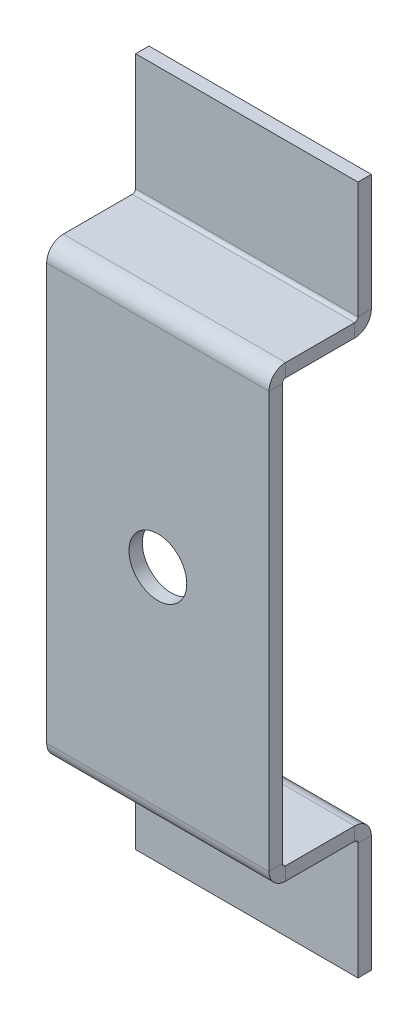
ISO-10303-21;
HEADER;
FILE_DESCRIPTION(('STEP AP214'),'2;1');
FILE_NAME('part.step','',(''),(''),'','','');
FILE_SCHEMA(('AUTOMOTIVE_DESIGN { 1 0 10303 214 1 1 1 1 }'));
ENDSEC;
DATA;
#1=APPLICATION_CONTEXT('core data for automotive mechanical design processes');
#2=APPLICATION_PROTOCOL_DEFINITION('international standard','automotive_design',2000,#1);
#3=PRODUCT_CONTEXT('',#1,'mechanical');
#4=PRODUCT('Part','Part','',(#3));
#5=PRODUCT_RELATED_PRODUCT_CATEGORY('part','',(#4));
#6=PRODUCT_DEFINITION_FORMATION('','',#4);
#7=PRODUCT_DEFINITION_CONTEXT('part definition',#1,'design');
#8=PRODUCT_DEFINITION('design','',#6,#7);
#9=PRODUCT_DEFINITION_SHAPE('','',#8);
#10=(LENGTH_UNIT() NAMED_UNIT(*) SI_UNIT(.MILLI.,.METRE.));
#11=(NAMED_UNIT(*) PLANE_ANGLE_UNIT() SI_UNIT($,.RADIAN.));
#12=(NAMED_UNIT(*) SI_UNIT($,.STERADIAN.) SOLID_ANGLE_UNIT());
#13=UNCERTAINTY_MEASURE_WITH_UNIT(LENGTH_MEASURE(1.E-05),#10,'distance_accuracy_value','');
#14=(GEOMETRIC_REPRESENTATION_CONTEXT(3) GLOBAL_UNCERTAINTY_ASSIGNED_CONTEXT((#13)) GLOBAL_UNIT_ASSIGNED_CONTEXT((#10,
#11,#12)) REPRESENTATION_CONTEXT('',''));
#15=CARTESIAN_POINT('',(0.,0.,0.));
#16=DIRECTION('',(0.,0.,1.));
#17=DIRECTION('',(1.,0.,0.));
#18=AXIS2_PLACEMENT_3D('',#15,#16,#17);
#19=CARTESIAN_POINT('',(0.,98.0000000000001,-20.));
#20=DIRECTION('',(-1.,0.,0.));
#21=DIRECTION('',(0.,0.,1.));
#22=AXIS2_PLACEMENT_3D('',#19,#20,#21);
#23=PLANE('',#22);
#24=DIRECTION('',(0.,0.,-1.));
#25=VECTOR('',#24,1.);
#26=CARTESIAN_POINT('',(0.,98.0000000000001,-20.));
#27=LINE('',#26,#25);
#28=CARTESIAN_POINT('',(0.,98.,-3.7366));
#29=VERTEX_POINT('',#28);
#30=CARTESIAN_POINT('',(0.,98.0000000000001,-19.2634));
#31=VERTEX_POINT('',#30);
#32=EDGE_CURVE('E351',#29,#31,#27,.T.);
#33=ORIENTED_EDGE('',*,*,#32,.T.);
#34=DIRECTION('',(0.,-1.,0.));
#35=VECTOR('',#34,1.);
#36=CARTESIAN_POINT('',(0.,98.0000000000001,-19.2634));
#37=LINE('',#36,#35);
#38=CARTESIAN_POINT('',(0.,95.0000000000001,-19.2634));
#39=VERTEX_POINT('',#38);
#40=EDGE_CURVE('E233',#31,#39,#37,.T.);
#41=ORIENTED_EDGE('',*,*,#40,.T.);
#42=DIRECTION('',(0.,0.,-1.));
#43=VECTOR('',#42,1.);
#44=CARTESIAN_POINT('',(0.,95.0000000000001,-20.));
#45=LINE('',#44,#43);
#46=CARTESIAN_POINT('',(0.,95.,-3.73660000000001));
#47=VERTEX_POINT('',#46);
#48=EDGE_CURVE('E350',#47,#39,#45,.T.);
#49=ORIENTED_EDGE('',*,*,#48,.F.);
#50=DIRECTION('',(0.,1.,0.));
#51=VECTOR('',#50,1.);
#52=CARTESIAN_POINT('',(0.,95.,-3.73660000000001));
#53=LINE('',#52,#51);
#54=EDGE_CURVE('E336',#47,#29,#53,.T.);
#55=ORIENTED_EDGE('',*,*,#54,.T.);
#56=EDGE_LOOP('',(#33,#41,#49,#55));
#57=FACE_BOUND('',#56,.T.);
#58=ADVANCED_FACE('F39',(#57),#23,.T.);
#59=CARTESIAN_POINT('',(0.,98.,3.20683818544146E-13));
#60=DIRECTION('',(0.,1.,0.));
#61=DIRECTION('',(0.,0.,1.));
#62=AXIS2_PLACEMENT_3D('',#59,#60,#61);
#63=PLANE('',#62);
#64=DIRECTION('',(0.,0.,1.));
#65=VECTOR('',#64,1.);
#66=CARTESIAN_POINT('',(50.,98.,-2.99999999999999));
#67=LINE('',#66,#65);
#68=CARTESIAN_POINT('',(50.,98.0000000000001,-19.2634));
#69=VERTEX_POINT('',#68);
#70=CARTESIAN_POINT('',(50.,98.,-3.7366));
#71=VERTEX_POINT('',#70);
#72=EDGE_CURVE('E353',#69,#71,#67,.T.);
#73=ORIENTED_EDGE('',*,*,#72,.F.);
#74=DIRECTION('',(-1.,0.,0.));
#75=VECTOR('',#74,1.);
#76=CARTESIAN_POINT('',(0.,98.0000000000001,-19.2634));
#77=LINE('',#76,#75);
#78=EDGE_CURVE('E63',#31,#69,#77,.F.);
#79=ORIENTED_EDGE('',*,*,#78,.F.);
#80=ORIENTED_EDGE('',*,*,#32,.F.);
#81=DIRECTION('',(1.,0.,0.));
#82=VECTOR('',#81,1.);
#83=CARTESIAN_POINT('',(0.,98.,-3.7366));
#84=LINE('',#83,#82);
#85=EDGE_CURVE('E345',#29,#71,#84,.T.);
#86=ORIENTED_EDGE('',*,*,#85,.T.);
#87=EDGE_LOOP('',(#73,#79,#80,#86));
#88=FACE_BOUND('',#87,.T.);
#89=ADVANCED_FACE('F400',(#88),#63,.T.);
#90=CARTESIAN_POINT('',(0.,95.,3.10209374527617E-13));
#91=DIRECTION('',(0.,1.,0.));
#92=DIRECTION('',(0.,0.,1.));
#93=AXIS2_PLACEMENT_3D('',#90,#91,#92);
#94=PLANE('',#93);
#95=DIRECTION('',(-1.,0.,0.));
#96=VECTOR('',#95,1.);
#97=CARTESIAN_POINT('',(0.,95.0000000000001,-19.2634));
#98=LINE('',#97,#96);
#99=CARTESIAN_POINT('',(50.,95.0000000000001,-19.2634));
#100=VERTEX_POINT('',#99);
#101=EDGE_CURVE('E186',#39,#100,#98,.F.);
#102=ORIENTED_EDGE('',*,*,#101,.T.);
#103=DIRECTION('',(0.,0.,1.));
#104=VECTOR('',#103,1.);
#105=CARTESIAN_POINT('',(50.,95.,-3.));
#106=LINE('',#105,#104);
#107=CARTESIAN_POINT('',(50.,95.,-3.73660000000001));
#108=VERTEX_POINT('',#107);
#109=EDGE_CURVE('E354',#100,#108,#106,.T.);
#110=ORIENTED_EDGE('',*,*,#109,.T.);
#111=DIRECTION('',(1.,0.,0.));
#112=VECTOR('',#111,1.);
#113=CARTESIAN_POINT('',(0.,95.,-3.73660000000001));
#114=LINE('',#113,#112);
#115=EDGE_CURVE('E339',#47,#108,#114,.T.);
#116=ORIENTED_EDGE('',*,*,#115,.F.);
#117=ORIENTED_EDGE('',*,*,#48,.T.);
#118=EDGE_LOOP('',(#102,#110,#116,#117));
#119=FACE_BOUND('',#118,.T.);
#120=ADVANCED_FACE('F408',(#119),#94,.F.);
#121=CARTESIAN_POINT('',(50.,-3.,-2.99999999999999));
#122=DIRECTION('',(1.,0.,0.));
#123=DIRECTION('',(0.,0.,-1.));
#124=AXIS2_PLACEMENT_3D('',#121,#122,#123);
#125=PLANE('',#124);
#126=DIRECTION('',(0.,0.,-1.));
#127=VECTOR('',#126,1.);
#128=CARTESIAN_POINT('',(50.,-3.,-2.99999999999999));
#129=LINE('',#128,#127);
#130=CARTESIAN_POINT('',(50.,-3.,-3.73659999999999));
#131=VERTEX_POINT('',#130);
#132=CARTESIAN_POINT('',(50.,-3.00000000000006,-19.2634));
#133=VERTEX_POINT('',#132);
#134=EDGE_CURVE('E306',#131,#133,#129,.T.);
#135=ORIENTED_EDGE('',*,*,#134,.T.);
#136=DIRECTION('',(0.,1.,0.));
#137=VECTOR('',#136,1.);
#138=CARTESIAN_POINT('',(50.,-3.00000000000006,-19.2634));
#139=LINE('',#138,#137);
#140=CARTESIAN_POINT('',(50.,0.,-19.2634));
#141=VERTEX_POINT('',#140);
#142=EDGE_CURVE('E279',#133,#141,#139,.T.);
#143=ORIENTED_EDGE('',*,*,#142,.T.);
#144=DIRECTION('',(0.,0.,-1.));
#145=VECTOR('',#144,1.);
#146=CARTESIAN_POINT('',(50.,0.,-3.));
#147=LINE('',#146,#145);
#148=CARTESIAN_POINT('',(50.,0.,-3.7366));
#149=VERTEX_POINT('',#148);
#150=EDGE_CURVE('E305',#149,#141,#147,.T.);
#151=ORIENTED_EDGE('',*,*,#150,.F.);
#152=DIRECTION('',(0.,-1.,0.));
#153=VECTOR('',#152,1.);
#154=CARTESIAN_POINT('',(50.,0.,-3.7366));
#155=LINE('',#154,#153);
#156=EDGE_CURVE('E292',#149,#131,#155,.T.);
#157=ORIENTED_EDGE('',*,*,#156,.T.);
#158=EDGE_LOOP('',(#135,#143,#151,#157));
#159=FACE_BOUND('',#158,.T.);
#160=ADVANCED_FACE('F432',(#159),#125,.T.);
#161=CARTESIAN_POINT('',(0.,-2.99999999999999,0.));
#162=DIRECTION('',(0.,1.,0.));
#163=DIRECTION('',(0.,0.,1.));
#164=AXIS2_PLACEMENT_3D('',#161,#162,#163);
#165=PLANE('',#164);
#166=DIRECTION('',(1.,0.,0.));
#167=VECTOR('',#166,1.);
#168=CARTESIAN_POINT('',(50.,-3.00000000000006,-19.2634));
#169=LINE('',#168,#167);
#170=CARTESIAN_POINT('',(0.,-3.00000000000006,-19.2634));
#171=VERTEX_POINT('',#170);
#172=EDGE_CURVE('E285',#133,#171,#169,.F.);
#173=ORIENTED_EDGE('',*,*,#172,.F.);
#174=ORIENTED_EDGE('',*,*,#134,.F.);
#175=DIRECTION('',(1.,0.,0.));
#176=VECTOR('',#175,1.);
#177=CARTESIAN_POINT('',(0.,-3.,-3.73659999999999));
#178=LINE('',#177,#176);
#179=CARTESIAN_POINT('',(0.,-3.,-3.73659999999999));
#180=VERTEX_POINT('',#179);
#181=EDGE_CURVE('E301',#180,#131,#178,.T.);
#182=ORIENTED_EDGE('',*,*,#181,.F.);
#183=DIRECTION('',(0.,0.,1.));
#184=VECTOR('',#183,1.);
#185=CARTESIAN_POINT('',(0.,-3.00000000000006,-20.));
#186=LINE('',#185,#184);
#187=EDGE_CURVE('E309',#171,#180,#186,.T.);
#188=ORIENTED_EDGE('',*,*,#187,.F.);
#189=EDGE_LOOP('',(#173,#174,#182,#188));
#190=FACE_BOUND('',#189,.T.);
#191=ADVANCED_FACE('F445',(#190),#165,.F.);
#192=CARTESIAN_POINT('',(0.,0.,0.));
#193=DIRECTION('',(0.,1.,0.));
#194=DIRECTION('',(0.,0.,1.));
#195=AXIS2_PLACEMENT_3D('',#192,#193,#194);
#196=PLANE('',#195);
#197=ORIENTED_EDGE('',*,*,#150,.T.);
#198=DIRECTION('',(1.,0.,0.));
#199=VECTOR('',#198,1.);
#200=CARTESIAN_POINT('',(50.,0.,-19.2634));
#201=LINE('',#200,#199);
#202=CARTESIAN_POINT('',(0.,0.,-19.2634));
#203=VERTEX_POINT('',#202);
#204=EDGE_CURVE('E272',#141,#203,#201,.F.);
#205=ORIENTED_EDGE('',*,*,#204,.T.);
#206=DIRECTION('',(0.,0.,1.));
#207=VECTOR('',#206,1.);
#208=CARTESIAN_POINT('',(0.,0.,-20.));
#209=LINE('',#208,#207);
#210=CARTESIAN_POINT('',(0.,0.,-3.7366));
#211=VERTEX_POINT('',#210);
#212=EDGE_CURVE('E310',#203,#211,#209,.T.);
#213=ORIENTED_EDGE('',*,*,#212,.T.);
#214=DIRECTION('',(-1.,0.,0.));
#215=VECTOR('',#214,1.);
#216=CARTESIAN_POINT('',(50.,0.,-3.7366));
#217=LINE('',#216,#215);
#218=EDGE_CURVE('E295',#149,#211,#217,.T.);
#219=ORIENTED_EDGE('',*,*,#218,.F.);
#220=EDGE_LOOP('',(#197,#205,#213,#219));
#221=FACE_BOUND('',#220,.T.);
#222=ADVANCED_FACE('F429',(#221),#196,.T.);
#223=CARTESIAN_POINT('',(0.,0.,-3.));
#224=DIRECTION('',(0.,0.,-1.));
#225=DIRECTION('',(-1.,0.,0.));
#226=AXIS2_PLACEMENT_3D('',#223,#224,#225);
#227=PLANE('',#226);
#228=CARTESIAN_POINT('',(25.,47.4999999999999,-3.));
#229=DIRECTION('',(0.,0.,-1.));
#230=DIRECTION('',(-1.,0.,0.));
#231=AXIS2_PLACEMENT_3D('',#228,#229,#230);
#232=CIRCLE('',#231,6.5);
#233=CARTESIAN_POINT('',(18.5,47.4999999999999,-3.));
#234=VERTEX_POINT('',#233);
#235=EDGE_CURVE('E489',#234,#234,#232,.T.);
#236=ORIENTED_EDGE('',*,*,#235,.F.);
#237=EDGE_LOOP('',(#236));
#238=FACE_BOUND('',#237,.T.);
#239=DIRECTION('',(0.,1.,0.));
#240=VECTOR('',#239,1.);
#241=CARTESIAN_POINT('',(50.,0.,-3.));
#242=LINE('',#241,#240);
#243=CARTESIAN_POINT('',(50.,0.736600000000001,-3.));
#244=VERTEX_POINT('',#243);
#245=CARTESIAN_POINT('',(50.,94.2634,-3.));
#246=VERTEX_POINT('',#245);
#247=EDGE_CURVE('E11',#244,#246,#242,.T.);
#248=ORIENTED_EDGE('',*,*,#247,.F.);
#249=DIRECTION('',(-1.,0.,0.));
#250=VECTOR('',#249,1.);
#251=CARTESIAN_POINT('',(0.,0.736599999999997,-3.));
#252=LINE('',#251,#250);
#253=CARTESIAN_POINT('',(0.,0.736599999999997,-3.));
#254=VERTEX_POINT('',#253);
#255=EDGE_CURVE('E328',#254,#244,#252,.F.);
#256=ORIENTED_EDGE('',*,*,#255,.F.);
#257=DIRECTION('',(0.,-1.,0.));
#258=VECTOR('',#257,1.);
#259=CARTESIAN_POINT('',(0.,0.,-3.));
#260=LINE('',#259,#258);
#261=CARTESIAN_POINT('',(0.,94.2634,-3.));
#262=VERTEX_POINT('',#261);
#263=EDGE_CURVE('E48',#262,#254,#260,.T.);
#264=ORIENTED_EDGE('',*,*,#263,.F.);
#265=DIRECTION('',(1.,0.,0.));
#266=VECTOR('',#265,1.);
#267=CARTESIAN_POINT('',(50.,94.2634,-3.));
#268=LINE('',#267,#266);
#269=EDGE_CURVE('E372',#246,#262,#268,.F.);
#270=ORIENTED_EDGE('',*,*,#269,.F.);
#271=EDGE_LOOP('',(#248,#256,#264,#270));
#272=FACE_BOUND('',#271,.T.);
#273=ADVANCED_FACE('F415',(#238,#272),#227,.T.);
#274=CARTESIAN_POINT('',(0.,0.,0.));
#275=DIRECTION('',(0.,0.,-1.));
#276=DIRECTION('',(-1.,0.,0.));
#277=AXIS2_PLACEMENT_3D('',#274,#275,#276);
#278=PLANE('',#277);
#279=CARTESIAN_POINT('',(25.,47.4999999999999,0.));
#280=DIRECTION('',(0.,0.,1.));
#281=DIRECTION('',(1.,0.,0.));
#282=AXIS2_PLACEMENT_3D('',#279,#280,#281);
#283=CIRCLE('',#282,6.5);
#284=CARTESIAN_POINT('',(31.5,47.4999999999999,0.));
#285=VERTEX_POINT('',#284);
#286=EDGE_CURVE('E487',#285,#285,#283,.T.);
#287=ORIENTED_EDGE('',*,*,#286,.F.);
#288=EDGE_LOOP('',(#287));
#289=FACE_BOUND('',#288,.T.);
#290=DIRECTION('',(-1.,0.,0.));
#291=VECTOR('',#290,1.);
#292=CARTESIAN_POINT('',(0.,0.736600000000005,0.));
#293=LINE('',#292,#291);
#294=CARTESIAN_POINT('',(0.,0.736600000000005,0.));
#295=VERTEX_POINT('',#294);
#296=CARTESIAN_POINT('',(50.,0.736600000000001,0.));
#297=VERTEX_POINT('',#296);
#298=EDGE_CURVE('E316',#295,#297,#293,.F.);
#299=ORIENTED_EDGE('',*,*,#298,.T.);
#300=DIRECTION('',(0.,1.,0.));
#301=VECTOR('',#300,1.);
#302=CARTESIAN_POINT('',(50.,0.,0.));
#303=LINE('',#302,#301);
#304=CARTESIAN_POINT('',(50.,94.2634,0.));
#305=VERTEX_POINT('',#304);
#306=EDGE_CURVE('E43',#297,#305,#303,.T.);
#307=ORIENTED_EDGE('',*,*,#306,.T.);
#308=DIRECTION('',(1.,0.,0.));
#309=VECTOR('',#308,1.);
#310=CARTESIAN_POINT('',(50.,94.2634,0.));
#311=LINE('',#310,#309);
#312=CARTESIAN_POINT('',(0.,94.2634,0.));
#313=VERTEX_POINT('',#312);
#314=EDGE_CURVE('E360',#305,#313,#311,.F.);
#315=ORIENTED_EDGE('',*,*,#314,.T.);
#316=DIRECTION('',(0.,-1.,0.));
#317=VECTOR('',#316,1.);
#318=CARTESIAN_POINT('',(0.,0.,0.));
#319=LINE('',#318,#317);
#320=EDGE_CURVE('E380',#313,#295,#319,.T.);
#321=ORIENTED_EDGE('',*,*,#320,.T.);
#322=EDGE_LOOP('',(#299,#307,#315,#321));
#323=FACE_BOUND('',#322,.T.);
#324=ADVANCED_FACE('F388',(#289,#323),#278,.F.);
#325=CARTESIAN_POINT('',(0.,0.,-3.));
#326=DIRECTION('',(-1.,0.,0.));
#327=DIRECTION('',(0.,-1.,0.));
#328=AXIS2_PLACEMENT_3D('',#325,#326,#327);
#329=PLANE('',#328);
#330=ORIENTED_EDGE('',*,*,#263,.T.);
#331=DIRECTION('',(0.,0.,1.));
#332=VECTOR('',#331,1.);
#333=CARTESIAN_POINT('',(0.,0.736599999999997,-3.));
#334=LINE('',#333,#332);
#335=EDGE_CURVE('E322',#254,#295,#334,.T.);
#336=ORIENTED_EDGE('',*,*,#335,.T.);
#337=ORIENTED_EDGE('',*,*,#320,.F.);
#338=DIRECTION('',(0.,0.,1.));
#339=VECTOR('',#338,1.);
#340=CARTESIAN_POINT('',(0.,94.2634,-3.));
#341=LINE('',#340,#339);
#342=EDGE_CURVE('E377',#262,#313,#341,.T.);
#343=ORIENTED_EDGE('',*,*,#342,.F.);
#344=EDGE_LOOP('',(#330,#336,#337,#343));
#345=FACE_BOUND('',#344,.T.);
#346=ADVANCED_FACE('F41',(#345),#329,.T.);
#347=CARTESIAN_POINT('',(50.,0.,-3.));
#348=DIRECTION('',(1.,0.,0.));
#349=DIRECTION('',(0.,1.,0.));
#350=AXIS2_PLACEMENT_3D('',#347,#348,#349);
#351=PLANE('',#350);
#352=DIRECTION('',(0.,0.,1.));
#353=VECTOR('',#352,1.);
#354=CARTESIAN_POINT('',(50.,0.736600000000001,-3.));
#355=LINE('',#354,#353);
#356=EDGE_CURVE('E333',#244,#297,#355,.T.);
#357=ORIENTED_EDGE('',*,*,#356,.F.);
#358=ORIENTED_EDGE('',*,*,#247,.T.);
#359=DIRECTION('',(0.,0.,1.));
#360=VECTOR('',#359,1.);
#361=CARTESIAN_POINT('',(50.,94.2634,-3.));
#362=LINE('',#361,#360);
#363=EDGE_CURVE('E366',#246,#305,#362,.T.);
#364=ORIENTED_EDGE('',*,*,#363,.T.);
#365=ORIENTED_EDGE('',*,*,#306,.F.);
#366=EDGE_LOOP('',(#357,#358,#364,#365));
#367=FACE_BOUND('',#366,.T.);
#368=ADVANCED_FACE('F455',(#367),#351,.T.);
#369=CARTESIAN_POINT('',(0.,94.2634,-3.73660000000001));
#370=DIRECTION('',(-1.,0.,0.));
#371=DIRECTION('',(0.,0.,1.));
#372=AXIS2_PLACEMENT_3D('',#369,#370,#371);
#373=PLANE('',#372);
#374=ORIENTED_EDGE('',*,*,#54,.F.);
#375=CARTESIAN_POINT('',(0.,94.2634,-3.73660000000001));
#376=DIRECTION('',(1.,0.,0.));
#377=DIRECTION('',(0.,0.,-1.));
#378=AXIS2_PLACEMENT_3D('',#375,#376,#377);
#379=CIRCLE('',#378,0.736600000000004);
#380=EDGE_CURVE('E369',#262,#47,#379,.F.);
#381=ORIENTED_EDGE('',*,*,#380,.F.);
#382=ORIENTED_EDGE('',*,*,#342,.T.);
#383=CARTESIAN_POINT('',(0.,94.2634,-3.73660000000001));
#384=DIRECTION('',(1.,0.,0.));
#385=DIRECTION('',(0.,0.,-1.));
#386=AXIS2_PLACEMENT_3D('',#383,#384,#385);
#387=CIRCLE('',#386,3.7366);
#388=EDGE_CURVE('E362',#313,#29,#387,.F.);
#389=ORIENTED_EDGE('',*,*,#388,.T.);
#390=EDGE_LOOP('',(#374,#381,#382,#389));
#391=FACE_BOUND('',#390,.T.);
#392=ADVANCED_FACE('F402',(#391),#373,.T.);
#393=CARTESIAN_POINT('',(50.,94.2634,-3.73660000000001));
#394=DIRECTION('',(-1.,0.,0.));
#395=DIRECTION('',(0.,0.,1.));
#396=AXIS2_PLACEMENT_3D('',#393,#394,#395);
#397=PLANE('',#396);
#398=CARTESIAN_POINT('',(50.,94.2634,-3.73660000000001));
#399=DIRECTION('',(1.,0.,0.));
#400=DIRECTION('',(0.,0.,-1.));
#401=AXIS2_PLACEMENT_3D('',#398,#399,#400);
#402=CIRCLE('',#401,0.736600000000004);
#403=EDGE_CURVE('E356',#108,#246,#402,.T.);
#404=ORIENTED_EDGE('',*,*,#403,.F.);
#405=DIRECTION('',(0.,1.,0.));
#406=VECTOR('',#405,1.);
#407=CARTESIAN_POINT('',(50.,95.,-3.73660000000001));
#408=LINE('',#407,#406);
#409=EDGE_CURVE('E342',#108,#71,#408,.T.);
#410=ORIENTED_EDGE('',*,*,#409,.T.);
#411=CARTESIAN_POINT('',(50.,94.2634,-3.73660000000001));
#412=DIRECTION('',(1.,0.,0.));
#413=DIRECTION('',(0.,0.,-1.));
#414=AXIS2_PLACEMENT_3D('',#411,#412,#413);
#415=CIRCLE('',#414,3.7366);
#416=EDGE_CURVE('E363',#71,#305,#415,.T.);
#417=ORIENTED_EDGE('',*,*,#416,.T.);
#418=ORIENTED_EDGE('',*,*,#363,.F.);
#419=EDGE_LOOP('',(#404,#410,#417,#418));
#420=FACE_BOUND('',#419,.T.);
#421=ADVANCED_FACE('F398',(#420),#397,.F.);
#422=CARTESIAN_POINT('',(50.,94.2634,-3.73660000000001));
#423=DIRECTION('',(1.,0.,0.));
#424=DIRECTION('',(0.,1.,0.));
#425=AXIS2_PLACEMENT_3D('',#422,#423,#424);
#426=CYLINDRICAL_SURFACE('',#425,3.7366);
#427=ORIENTED_EDGE('',*,*,#314,.F.);
#428=ORIENTED_EDGE('',*,*,#416,.F.);
#429=ORIENTED_EDGE('',*,*,#85,.F.);
#430=ORIENTED_EDGE('',*,*,#388,.F.);
#431=EDGE_LOOP('',(#427,#428,#429,#430));
#432=FACE_BOUND('',#431,.T.);
#433=ADVANCED_FACE('F394',(#432),#426,.T.);
#434=CARTESIAN_POINT('',(50.,94.2634,-3.73660000000001));
#435=DIRECTION('',(1.,0.,0.));
#436=DIRECTION('',(0.,1.,0.));
#437=AXIS2_PLACEMENT_3D('',#434,#435,#436);
#438=CYLINDRICAL_SURFACE('',#437,0.736600000000004);
#439=ORIENTED_EDGE('',*,*,#269,.T.);
#440=ORIENTED_EDGE('',*,*,#380,.T.);
#441=ORIENTED_EDGE('',*,*,#115,.T.);
#442=ORIENTED_EDGE('',*,*,#403,.T.);
#443=EDGE_LOOP('',(#439,#440,#441,#442));
#444=FACE_BOUND('',#443,.T.);
#445=ADVANCED_FACE('F410',(#444),#438,.F.);
#446=CARTESIAN_POINT('',(50.,98.,-2.99999999999999));
#447=DIRECTION('',(1.,0.,0.));
#448=DIRECTION('',(0.,0.,-1.));
#449=AXIS2_PLACEMENT_3D('',#446,#447,#448);
#450=PLANE('',#449);
#451=DIRECTION('',(0.,-1.,0.));
#452=VECTOR('',#451,1.);
#453=CARTESIAN_POINT('',(50.,98.0000000000001,-19.2634));
#454=LINE('',#453,#452);
#455=EDGE_CURVE('E56',#69,#100,#454,.T.);
#456=ORIENTED_EDGE('',*,*,#455,.F.);
#457=ORIENTED_EDGE('',*,*,#72,.T.);
#458=ORIENTED_EDGE('',*,*,#409,.F.);
#459=ORIENTED_EDGE('',*,*,#109,.F.);
#460=EDGE_LOOP('',(#456,#457,#458,#459));
#461=FACE_BOUND('',#460,.T.);
#462=ADVANCED_FACE('F471',(#461),#450,.T.);
#463=CARTESIAN_POINT('',(50.,0.736599999999999,-3.7366));
#464=DIRECTION('',(1.,0.,0.));
#465=DIRECTION('',(0.,1.,0.));
#466=AXIS2_PLACEMENT_3D('',#463,#464,#465);
#467=PLANE('',#466);
#468=ORIENTED_EDGE('',*,*,#156,.F.);
#469=CARTESIAN_POINT('',(50.,0.736599999999999,-3.7366));
#470=DIRECTION('',(-1.,0.,0.));
#471=DIRECTION('',(0.,-1.,0.));
#472=AXIS2_PLACEMENT_3D('',#469,#470,#471);
#473=CIRCLE('',#472,0.736600000000002);
#474=EDGE_CURVE('E325',#244,#149,#473,.F.);
#475=ORIENTED_EDGE('',*,*,#474,.F.);
#476=ORIENTED_EDGE('',*,*,#356,.T.);
#477=CARTESIAN_POINT('',(50.,0.736599999999999,-3.7366));
#478=DIRECTION('',(-1.,0.,0.));
#479=DIRECTION('',(0.,-1.,0.));
#480=AXIS2_PLACEMENT_3D('',#477,#478,#479);
#481=CIRCLE('',#480,3.7366);
#482=EDGE_CURVE('E318',#297,#131,#481,.F.);
#483=ORIENTED_EDGE('',*,*,#482,.T.);
#484=EDGE_LOOP('',(#468,#475,#476,#483));
#485=FACE_BOUND('',#484,.T.);
#486=ADVANCED_FACE('F454',(#485),#467,.T.);
#487=CARTESIAN_POINT('',(0.,0.736599999999996,-3.7366));
#488=DIRECTION('',(1.,0.,0.));
#489=DIRECTION('',(0.,1.,0.));
#490=AXIS2_PLACEMENT_3D('',#487,#488,#489);
#491=PLANE('',#490);
#492=CARTESIAN_POINT('',(0.,0.736599999999996,-3.7366));
#493=DIRECTION('',(-1.,0.,0.));
#494=DIRECTION('',(0.,-1.,0.));
#495=AXIS2_PLACEMENT_3D('',#492,#493,#494);
#496=CIRCLE('',#495,0.736600000000002);
#497=EDGE_CURVE('E312',#211,#254,#496,.T.);
#498=ORIENTED_EDGE('',*,*,#497,.F.);
#499=DIRECTION('',(0.,-1.,0.));
#500=VECTOR('',#499,1.);
#501=CARTESIAN_POINT('',(0.,0.,-3.7366));
#502=LINE('',#501,#500);
#503=EDGE_CURVE('E298',#211,#180,#502,.T.);
#504=ORIENTED_EDGE('',*,*,#503,.T.);
#505=CARTESIAN_POINT('',(0.,0.736599999999996,-3.7366));
#506=DIRECTION('',(-1.,0.,0.));
#507=DIRECTION('',(0.,-1.,0.));
#508=AXIS2_PLACEMENT_3D('',#505,#506,#507);
#509=CIRCLE('',#508,3.7366);
#510=EDGE_CURVE('E319',#180,#295,#509,.T.);
#511=ORIENTED_EDGE('',*,*,#510,.T.);
#512=ORIENTED_EDGE('',*,*,#335,.F.);
#513=EDGE_LOOP('',(#498,#504,#511,#512));
#514=FACE_BOUND('',#513,.T.);
#515=ADVANCED_FACE('F420',(#514),#491,.F.);
#516=CARTESIAN_POINT('',(0.,0.736599999999996,-3.7366));
#517=DIRECTION('',(-1.,0.,0.));
#518=DIRECTION('',(0.,-1.,0.));
#519=AXIS2_PLACEMENT_3D('',#516,#517,#518);
#520=CYLINDRICAL_SURFACE('',#519,3.7366);
#521=ORIENTED_EDGE('',*,*,#298,.F.);
#522=ORIENTED_EDGE('',*,*,#510,.F.);
#523=ORIENTED_EDGE('',*,*,#181,.T.);
#524=ORIENTED_EDGE('',*,*,#482,.F.);
#525=EDGE_LOOP('',(#521,#522,#523,#524));
#526=FACE_BOUND('',#525,.T.);
#527=ADVANCED_FACE('F451',(#526),#520,.T.);
#528=CARTESIAN_POINT('',(0.,0.736599999999996,-3.7366));
#529=DIRECTION('',(-1.,0.,0.));
#530=DIRECTION('',(0.,-1.,0.));
#531=AXIS2_PLACEMENT_3D('',#528,#529,#530);
#532=CYLINDRICAL_SURFACE('',#531,0.736600000000002);
#533=ORIENTED_EDGE('',*,*,#255,.T.);
#534=ORIENTED_EDGE('',*,*,#474,.T.);
#535=ORIENTED_EDGE('',*,*,#218,.T.);
#536=ORIENTED_EDGE('',*,*,#497,.T.);
#537=EDGE_LOOP('',(#533,#534,#535,#536));
#538=FACE_BOUND('',#537,.T.);
#539=ADVANCED_FACE('F424',(#538),#532,.F.);
#540=CARTESIAN_POINT('',(0.,-3.00000000000006,-20.));
#541=DIRECTION('',(-1.,0.,0.));
#542=DIRECTION('',(0.,0.,1.));
#543=AXIS2_PLACEMENT_3D('',#540,#541,#542);
#544=PLANE('',#543);
#545=DIRECTION('',(0.,1.,0.));
#546=VECTOR('',#545,1.);
#547=CARTESIAN_POINT('',(0.,-3.00000000000006,-19.2634));
#548=LINE('',#547,#546);
#549=EDGE_CURVE('E289',#171,#203,#548,.T.);
#550=ORIENTED_EDGE('',*,*,#549,.F.);
#551=ORIENTED_EDGE('',*,*,#187,.T.);
#552=ORIENTED_EDGE('',*,*,#503,.F.);
#553=ORIENTED_EDGE('',*,*,#212,.F.);
#554=EDGE_LOOP('',(#550,#551,#552,#553));
#555=FACE_BOUND('',#554,.T.);
#556=ADVANCED_FACE('F449',(#555),#544,.T.);
#557=CARTESIAN_POINT('',(0.,-3.73660000000006,-19.2634));
#558=DIRECTION('',(-1.,0.,0.));
#559=DIRECTION('',(0.,0.,1.));
#560=AXIS2_PLACEMENT_3D('',#557,#558,#559);
#561=PLANE('',#560);
#562=DIRECTION('',(0.,0.,-1.));
#563=VECTOR('',#562,1.);
#564=CARTESIAN_POINT('',(0.,-3.73660000000006,-20.));
#565=LINE('',#564,#563);
#566=CARTESIAN_POINT('',(0.,-3.73660000000006,-20.));
#567=VERTEX_POINT('',#566);
#568=CARTESIAN_POINT('',(0.,-3.73660000000006,-23.));
#569=VERTEX_POINT('',#568);
#570=EDGE_CURVE('E240',#567,#569,#565,.T.);
#571=ORIENTED_EDGE('',*,*,#570,.F.);
#572=CARTESIAN_POINT('',(0.,-3.73660000000006,-19.2634));
#573=DIRECTION('',(1.,0.,0.));
#574=DIRECTION('',(0.,0.,-1.));
#575=AXIS2_PLACEMENT_3D('',#572,#573,#574);
#576=CIRCLE('',#575,0.7366);
#577=EDGE_CURVE('E282',#171,#567,#576,.F.);
#578=ORIENTED_EDGE('',*,*,#577,.F.);
#579=ORIENTED_EDGE('',*,*,#549,.T.);
#580=CARTESIAN_POINT('',(0.,-3.73660000000006,-19.2634));
#581=DIRECTION('',(1.,0.,0.));
#582=DIRECTION('',(0.,0.,-1.));
#583=AXIS2_PLACEMENT_3D('',#580,#581,#582);
#584=CIRCLE('',#583,3.7366);
#585=EDGE_CURVE('E275',#203,#569,#584,.F.);
#586=ORIENTED_EDGE('',*,*,#585,.T.);
#587=EDGE_LOOP('',(#571,#578,#579,#586));
#588=FACE_BOUND('',#587,.T.);
#589=ADVANCED_FACE('F559',(#588),#561,.T.);
#590=CARTESIAN_POINT('',(50.,-3.73660000000006,-19.2634));
#591=DIRECTION('',(-1.,0.,0.));
#592=DIRECTION('',(0.,0.,1.));
#593=AXIS2_PLACEMENT_3D('',#590,#591,#592);
#594=PLANE('',#593);
#595=CARTESIAN_POINT('',(50.,-3.73660000000006,-19.2634));
#596=DIRECTION('',(1.,0.,0.));
#597=DIRECTION('',(0.,0.,-1.));
#598=AXIS2_PLACEMENT_3D('',#595,#596,#597);
#599=CIRCLE('',#598,0.7366);
#600=CARTESIAN_POINT('',(50.,-3.73660000000006,-20.));
#601=VERTEX_POINT('',#600);
#602=EDGE_CURVE('E271',#601,#133,#599,.T.);
#603=ORIENTED_EDGE('',*,*,#602,.F.);
#604=DIRECTION('',(0.,0.,-1.));
#605=VECTOR('',#604,1.);
#606=CARTESIAN_POINT('',(50.,-3.73660000000006,-20.));
#607=LINE('',#606,#605);
#608=CARTESIAN_POINT('',(50.,-3.73660000000003,-23.));
#609=VERTEX_POINT('',#608);
#610=EDGE_CURVE('E244',#601,#609,#607,.T.);
#611=ORIENTED_EDGE('',*,*,#610,.T.);
#612=CARTESIAN_POINT('',(50.,-3.73660000000006,-19.2634));
#613=DIRECTION('',(1.,0.,0.));
#614=DIRECTION('',(0.,0.,-1.));
#615=AXIS2_PLACEMENT_3D('',#612,#613,#614);
#616=CIRCLE('',#615,3.7366);
#617=EDGE_CURVE('E276',#609,#141,#616,.T.);
#618=ORIENTED_EDGE('',*,*,#617,.T.);
#619=ORIENTED_EDGE('',*,*,#142,.F.);
#620=EDGE_LOOP('',(#603,#611,#618,#619));
#621=FACE_BOUND('',#620,.T.);
#622=ADVANCED_FACE('F436',(#621),#594,.F.);
#623=CARTESIAN_POINT('',(50.,-3.73660000000006,-19.2634));
#624=DIRECTION('',(1.,0.,0.));
#625=DIRECTION('',(0.,0.,-1.));
#626=AXIS2_PLACEMENT_3D('',#623,#624,#625);
#627=CYLINDRICAL_SURFACE('',#626,3.7366);
#628=ORIENTED_EDGE('',*,*,#204,.F.);
#629=ORIENTED_EDGE('',*,*,#617,.F.);
#630=DIRECTION('',(-1.,0.,0.));
#631=VECTOR('',#630,1.);
#632=CARTESIAN_POINT('',(0.,-3.73660000000003,-23.));
#633=LINE('',#632,#631);
#634=EDGE_CURVE('E247',#609,#569,#633,.T.);
#635=ORIENTED_EDGE('',*,*,#634,.T.);
#636=ORIENTED_EDGE('',*,*,#585,.F.);
#637=EDGE_LOOP('',(#628,#629,#635,#636));
#638=FACE_BOUND('',#637,.T.);
#639=ADVANCED_FACE('F553',(#638),#627,.T.);
#640=CARTESIAN_POINT('',(50.,-3.73660000000006,-19.2634));
#641=DIRECTION('',(1.,0.,0.));
#642=DIRECTION('',(0.,0.,-1.));
#643=AXIS2_PLACEMENT_3D('',#640,#641,#642);
#644=CYLINDRICAL_SURFACE('',#643,0.7366);
#645=ORIENTED_EDGE('',*,*,#172,.T.);
#646=ORIENTED_EDGE('',*,*,#577,.T.);
#647=DIRECTION('',(1.,0.,0.));
#648=VECTOR('',#647,1.);
#649=CARTESIAN_POINT('',(0.,-3.73660000000006,-20.));
#650=LINE('',#649,#648);
#651=EDGE_CURVE('E242',#567,#601,#650,.T.);
#652=ORIENTED_EDGE('',*,*,#651,.T.);
#653=ORIENTED_EDGE('',*,*,#602,.T.);
#654=EDGE_LOOP('',(#645,#646,#652,#653));
#655=FACE_BOUND('',#654,.T.);
#656=ADVANCED_FACE('F440',(#655),#644,.F.);
#657=CARTESIAN_POINT('',(50.,-30.0000000000001,-23.));
#658=DIRECTION('',(-1.,0.,0.));
#659=DIRECTION('',(0.,0.,1.));
#660=AXIS2_PLACEMENT_3D('',#657,#658,#659);
#661=PLANE('',#660);
#662=ORIENTED_EDGE('',*,*,#610,.F.);
#663=DIRECTION('',(0.,-1.,0.));
#664=VECTOR('',#663,1.);
#665=CARTESIAN_POINT('',(50.,-30.0000000000001,-20.));
#666=LINE('',#665,#664);
#667=CARTESIAN_POINT('',(50.,-30.0000000000001,-20.));
#668=VERTEX_POINT('',#667);
#669=EDGE_CURVE('E251',#601,#668,#666,.T.);
#670=ORIENTED_EDGE('',*,*,#669,.T.);
#671=DIRECTION('',(0.,0.,1.));
#672=VECTOR('',#671,1.);
#673=CARTESIAN_POINT('',(50.,-30.0000000000001,-23.));
#674=LINE('',#673,#672);
#675=CARTESIAN_POINT('',(50.,-30.0000000000001,-23.));
#676=VERTEX_POINT('',#675);
#677=EDGE_CURVE('E268',#676,#668,#674,.T.);
#678=ORIENTED_EDGE('',*,*,#677,.F.);
#679=DIRECTION('',(0.,-1.,0.));
#680=VECTOR('',#679,1.);
#681=CARTESIAN_POINT('',(50.,-30.0000000000001,-23.));
#682=LINE('',#681,#680);
#683=EDGE_CURVE('E252',#609,#676,#682,.T.);
#684=ORIENTED_EDGE('',*,*,#683,.F.);
#685=EDGE_LOOP('',(#662,#670,#678,#684));
#686=FACE_BOUND('',#685,.T.);
#687=ADVANCED_FACE('F545',(#686),#661,.F.);
#688=CARTESIAN_POINT('',(0.,-3.00000000000006,-23.));
#689=DIRECTION('',(1.,0.,0.));
#690=DIRECTION('',(0.,0.,-1.));
#691=AXIS2_PLACEMENT_3D('',#688,#689,#690);
#692=PLANE('',#691);
#693=ORIENTED_EDGE('',*,*,#570,.T.);
#694=DIRECTION('',(0.,1.,0.));
#695=VECTOR('',#694,1.);
#696=CARTESIAN_POINT('',(0.,-3.00000000000006,-23.));
#697=LINE('',#696,#695);
#698=CARTESIAN_POINT('',(0.,-30.0000000000001,-23.));
#699=VERTEX_POINT('',#698);
#700=EDGE_CURVE('E257',#699,#569,#697,.T.);
#701=ORIENTED_EDGE('',*,*,#700,.F.);
#702=DIRECTION('',(0.,0.,1.));
#703=VECTOR('',#702,1.);
#704=CARTESIAN_POINT('',(0.,-30.0000000000001,-23.));
#705=LINE('',#704,#703);
#706=CARTESIAN_POINT('',(0.,-30.0000000000001,-20.));
#707=VERTEX_POINT('',#706);
#708=EDGE_CURVE('E260',#699,#707,#705,.T.);
#709=ORIENTED_EDGE('',*,*,#708,.T.);
#710=DIRECTION('',(0.,1.,0.));
#711=VECTOR('',#710,1.);
#712=CARTESIAN_POINT('',(0.,-3.00000000000006,-20.));
#713=LINE('',#712,#711);
#714=EDGE_CURVE('E255',#707,#567,#713,.T.);
#715=ORIENTED_EDGE('',*,*,#714,.T.);
#716=EDGE_LOOP('',(#693,#701,#709,#715));
#717=FACE_BOUND('',#716,.T.);
#718=ADVANCED_FACE('F538',(#717),#692,.F.);
#719=CARTESIAN_POINT('',(0.,0.,-23.));
#720=DIRECTION('',(0.,0.,1.));
#721=DIRECTION('',(1.,0.,0.));
#722=AXIS2_PLACEMENT_3D('',#719,#720,#721);
#723=PLANE('',#722);
#724=ORIENTED_EDGE('',*,*,#634,.F.);
#725=ORIENTED_EDGE('',*,*,#683,.T.);
#726=DIRECTION('',(-1.,0.,0.));
#727=VECTOR('',#726,1.);
#728=CARTESIAN_POINT('',(0.,-30.0000000000001,-23.));
#729=LINE('',#728,#727);
#730=EDGE_CURVE('E254',#676,#699,#729,.T.);
#731=ORIENTED_EDGE('',*,*,#730,.T.);
#732=ORIENTED_EDGE('',*,*,#700,.T.);
#733=EDGE_LOOP('',(#724,#725,#731,#732));
#734=FACE_BOUND('',#733,.T.);
#735=ADVANCED_FACE('F534',(#734),#723,.F.);
#736=CARTESIAN_POINT('',(0.,0.,-20.));
#737=DIRECTION('',(0.,0.,1.));
#738=DIRECTION('',(1.,0.,0.));
#739=AXIS2_PLACEMENT_3D('',#736,#737,#738);
#740=PLANE('',#739);
#741=ORIENTED_EDGE('',*,*,#669,.F.);
#742=ORIENTED_EDGE('',*,*,#651,.F.);
#743=ORIENTED_EDGE('',*,*,#714,.F.);
#744=DIRECTION('',(-1.,0.,0.));
#745=VECTOR('',#744,1.);
#746=CARTESIAN_POINT('',(0.,-30.0000000000001,-20.));
#747=LINE('',#746,#745);
#748=EDGE_CURVE('E262',#668,#707,#747,.T.);
#749=ORIENTED_EDGE('',*,*,#748,.F.);
#750=EDGE_LOOP('',(#741,#742,#743,#749));
#751=FACE_BOUND('',#750,.T.);
#752=ADVANCED_FACE('F537',(#751),#740,.T.);
#753=CARTESIAN_POINT('',(0.,-30.0000000000001,-23.));
#754=DIRECTION('',(0.,1.,0.));
#755=DIRECTION('',(0.,0.,1.));
#756=AXIS2_PLACEMENT_3D('',#753,#754,#755);
#757=PLANE('',#756);
#758=ORIENTED_EDGE('',*,*,#748,.T.);
#759=ORIENTED_EDGE('',*,*,#708,.F.);
#760=ORIENTED_EDGE('',*,*,#730,.F.);
#761=ORIENTED_EDGE('',*,*,#677,.T.);
#762=EDGE_LOOP('',(#758,#759,#760,#761));
#763=FACE_BOUND('',#762,.T.);
#764=ADVANCED_FACE('F531',(#763),#757,.F.);
#765=CARTESIAN_POINT('',(50.,98.7366000000001,-19.2634));
#766=DIRECTION('',(1.,0.,0.));
#767=DIRECTION('',(0.,0.,-1.));
#768=AXIS2_PLACEMENT_3D('',#765,#766,#767);
#769=PLANE('',#768);
#770=DIRECTION('',(0.,0.,-1.));
#771=VECTOR('',#770,1.);
#772=CARTESIAN_POINT('',(50.,98.7366000000001,-20.));
#773=LINE('',#772,#771);
#774=CARTESIAN_POINT('',(50.,98.7366000000001,-20.));
#775=VERTEX_POINT('',#774);
#776=CARTESIAN_POINT('',(50.,98.7366000000001,-23.));
#777=VERTEX_POINT('',#776);
#778=EDGE_CURVE('E492',#775,#777,#773,.T.);
#779=ORIENTED_EDGE('',*,*,#778,.F.);
#780=CARTESIAN_POINT('',(50.,98.7366000000001,-19.2634));
#781=DIRECTION('',(-1.,0.,0.));
#782=DIRECTION('',(0.,0.,1.));
#783=AXIS2_PLACEMENT_3D('',#780,#781,#782);
#784=CIRCLE('',#783,0.7366);
#785=EDGE_CURVE('E189',#69,#775,#784,.F.);
#786=ORIENTED_EDGE('',*,*,#785,.F.);
#787=ORIENTED_EDGE('',*,*,#455,.T.);
#788=CARTESIAN_POINT('',(50.,98.7366000000001,-19.2634));
#789=DIRECTION('',(-1.,0.,0.));
#790=DIRECTION('',(0.,0.,1.));
#791=AXIS2_PLACEMENT_3D('',#788,#789,#790);
#792=CIRCLE('',#791,3.7366);
#793=EDGE_CURVE('E232',#100,#777,#792,.F.);
#794=ORIENTED_EDGE('',*,*,#793,.T.);
#795=EDGE_LOOP('',(#779,#786,#787,#794));
#796=FACE_BOUND('',#795,.T.);
#797=ADVANCED_FACE('F501',(#796),#769,.T.);
#798=CARTESIAN_POINT('',(0.,98.7366000000001,-19.2634));
#799=DIRECTION('',(1.,0.,0.));
#800=DIRECTION('',(0.,0.,-1.));
#801=AXIS2_PLACEMENT_3D('',#798,#799,#800);
#802=PLANE('',#801);
#803=CARTESIAN_POINT('',(0.,98.7366000000001,-19.2634));
#804=DIRECTION('',(-1.,0.,0.));
#805=DIRECTION('',(0.,0.,1.));
#806=AXIS2_PLACEMENT_3D('',#803,#804,#805);
#807=CIRCLE('',#806,0.7366);
#808=CARTESIAN_POINT('',(0.,98.7366000000001,-20.));
#809=VERTEX_POINT('',#808);
#810=EDGE_CURVE('E196',#809,#31,#807,.T.);
#811=ORIENTED_EDGE('',*,*,#810,.F.);
#812=DIRECTION('',(0.,0.,-1.));
#813=VECTOR('',#812,1.);
#814=CARTESIAN_POINT('',(0.,98.7366000000001,-20.));
#815=LINE('',#814,#813);
#816=CARTESIAN_POINT('',(0.,98.7366000000001,-23.));
#817=VERTEX_POINT('',#816);
#818=EDGE_CURVE('E193',#809,#817,#815,.T.);
#819=ORIENTED_EDGE('',*,*,#818,.T.);
#820=CARTESIAN_POINT('',(0.,98.7366000000001,-19.2634));
#821=DIRECTION('',(-1.,0.,0.));
#822=DIRECTION('',(0.,0.,1.));
#823=AXIS2_PLACEMENT_3D('',#820,#821,#822);
#824=CIRCLE('',#823,3.7366);
#825=EDGE_CURVE('E179',#817,#39,#824,.T.);
#826=ORIENTED_EDGE('',*,*,#825,.T.);
#827=ORIENTED_EDGE('',*,*,#40,.F.);
#828=EDGE_LOOP('',(#811,#819,#826,#827));
#829=FACE_BOUND('',#828,.T.);
#830=ADVANCED_FACE('F194',(#829),#802,.F.);
#831=CARTESIAN_POINT('',(0.,98.7366000000001,-19.2634));
#832=DIRECTION('',(-1.,0.,0.));
#833=DIRECTION('',(0.,0.,-1.));
#834=AXIS2_PLACEMENT_3D('',#831,#832,#833);
#835=CYLINDRICAL_SURFACE('',#834,3.7366);
#836=ORIENTED_EDGE('',*,*,#101,.F.);
#837=ORIENTED_EDGE('',*,*,#825,.F.);
#838=DIRECTION('',(1.,0.,0.));
#839=VECTOR('',#838,1.);
#840=CARTESIAN_POINT('',(0.,98.7366000000001,-23.));
#841=LINE('',#840,#839);
#842=EDGE_CURVE('E184',#817,#777,#841,.T.);
#843=ORIENTED_EDGE('',*,*,#842,.T.);
#844=ORIENTED_EDGE('',*,*,#793,.F.);
#845=EDGE_LOOP('',(#836,#837,#843,#844));
#846=FACE_BOUND('',#845,.T.);
#847=ADVANCED_FACE('F181',(#846),#835,.T.);
#848=CARTESIAN_POINT('',(0.,98.7366000000001,-19.2634));
#849=DIRECTION('',(-1.,0.,0.));
#850=DIRECTION('',(0.,0.,-1.));
#851=AXIS2_PLACEMENT_3D('',#848,#849,#850);
#852=CYLINDRICAL_SURFACE('',#851,0.7366);
#853=ORIENTED_EDGE('',*,*,#78,.T.);
#854=ORIENTED_EDGE('',*,*,#785,.T.);
#855=DIRECTION('',(-1.,0.,0.));
#856=VECTOR('',#855,1.);
#857=CARTESIAN_POINT('',(50.,98.7366000000001,-20.));
#858=LINE('',#857,#856);
#859=EDGE_CURVE('E200',#775,#809,#858,.T.);
#860=ORIENTED_EDGE('',*,*,#859,.T.);
#861=ORIENTED_EDGE('',*,*,#810,.T.);
#862=EDGE_LOOP('',(#853,#854,#860,#861));
#863=FACE_BOUND('',#862,.T.);
#864=ADVANCED_FACE('F504',(#863),#852,.F.);
#865=CARTESIAN_POINT('',(0.,125.,-23.));
#866=DIRECTION('',(1.,0.,0.));
#867=DIRECTION('',(0.,0.,-1.));
#868=AXIS2_PLACEMENT_3D('',#865,#866,#867);
#869=PLANE('',#868);
#870=ORIENTED_EDGE('',*,*,#818,.F.);
#871=DIRECTION('',(0.,1.,0.));
#872=VECTOR('',#871,1.);
#873=CARTESIAN_POINT('',(0.,125.,-20.));
#874=LINE('',#873,#872);
#875=CARTESIAN_POINT('',(0.,125.,-20.));
#876=VERTEX_POINT('',#875);
#877=EDGE_CURVE('E209',#809,#876,#874,.T.);
#878=ORIENTED_EDGE('',*,*,#877,.T.);
#879=DIRECTION('',(0.,0.,1.));
#880=VECTOR('',#879,1.);
#881=CARTESIAN_POINT('',(0.,125.,-23.));
#882=LINE('',#881,#880);
#883=CARTESIAN_POINT('',(0.,125.,-23.));
#884=VERTEX_POINT('',#883);
#885=EDGE_CURVE('E214',#884,#876,#882,.T.);
#886=ORIENTED_EDGE('',*,*,#885,.F.);
#887=DIRECTION('',(0.,1.,0.));
#888=VECTOR('',#887,1.);
#889=CARTESIAN_POINT('',(0.,125.,-23.));
#890=LINE('',#889,#888);
#891=EDGE_CURVE('E205',#817,#884,#890,.T.);
#892=ORIENTED_EDGE('',*,*,#891,.F.);
#893=EDGE_LOOP('',(#870,#878,#886,#892));
#894=FACE_BOUND('',#893,.T.);
#895=ADVANCED_FACE('F212',(#894),#869,.F.);
#896=CARTESIAN_POINT('',(50.,98.0000000000001,-23.));
#897=DIRECTION('',(-1.,0.,0.));
#898=DIRECTION('',(0.,0.,1.));
#899=AXIS2_PLACEMENT_3D('',#896,#897,#898);
#900=PLANE('',#899);
#901=ORIENTED_EDGE('',*,*,#778,.T.);
#902=DIRECTION('',(0.,-1.,0.));
#903=VECTOR('',#902,1.);
#904=CARTESIAN_POINT('',(50.,98.0000000000001,-23.));
#905=LINE('',#904,#903);
#906=CARTESIAN_POINT('',(50.,125.,-23.));
#907=VERTEX_POINT('',#906);
#908=EDGE_CURVE('E208',#907,#777,#905,.T.);
#909=ORIENTED_EDGE('',*,*,#908,.F.);
#910=DIRECTION('',(0.,0.,1.));
#911=VECTOR('',#910,1.);
#912=CARTESIAN_POINT('',(50.,125.,-23.));
#913=LINE('',#912,#911);
#914=CARTESIAN_POINT('',(50.,125.,-20.));
#915=VERTEX_POINT('',#914);
#916=EDGE_CURVE('E225',#907,#915,#913,.T.);
#917=ORIENTED_EDGE('',*,*,#916,.T.);
#918=DIRECTION('',(0.,-1.,0.));
#919=VECTOR('',#918,1.);
#920=CARTESIAN_POINT('',(50.,98.0000000000001,-20.));
#921=LINE('',#920,#919);
#922=EDGE_CURVE('E216',#915,#775,#921,.T.);
#923=ORIENTED_EDGE('',*,*,#922,.T.);
#924=EDGE_LOOP('',(#901,#909,#917,#923));
#925=FACE_BOUND('',#924,.T.);
#926=ADVANCED_FACE('F497',(#925),#900,.F.);
#927=CARTESIAN_POINT('',(0.,0.,-23.));
#928=DIRECTION('',(0.,0.,1.));
#929=DIRECTION('',(0.,-1.,0.));
#930=AXIS2_PLACEMENT_3D('',#927,#928,#929);
#931=PLANE('',#930);
#932=ORIENTED_EDGE('',*,*,#842,.F.);
#933=ORIENTED_EDGE('',*,*,#891,.T.);
#934=DIRECTION('',(1.,0.,0.));
#935=VECTOR('',#934,1.);
#936=CARTESIAN_POINT('',(50.,125.,-23.));
#937=LINE('',#936,#935);
#938=EDGE_CURVE('E215',#884,#907,#937,.T.);
#939=ORIENTED_EDGE('',*,*,#938,.T.);
#940=ORIENTED_EDGE('',*,*,#908,.T.);
#941=EDGE_LOOP('',(#932,#933,#939,#940));
#942=FACE_BOUND('',#941,.T.);
#943=ADVANCED_FACE('F204',(#942),#931,.F.);
#944=CARTESIAN_POINT('',(0.,0.,-20.));
#945=DIRECTION('',(0.,0.,1.));
#946=DIRECTION('',(0.,-1.,0.));
#947=AXIS2_PLACEMENT_3D('',#944,#945,#946);
#948=PLANE('',#947);
#949=ORIENTED_EDGE('',*,*,#877,.F.);
#950=ORIENTED_EDGE('',*,*,#859,.F.);
#951=ORIENTED_EDGE('',*,*,#922,.F.);
#952=DIRECTION('',(1.,0.,0.));
#953=VECTOR('',#952,1.);
#954=CARTESIAN_POINT('',(50.,125.,-20.));
#955=LINE('',#954,#953);
#956=EDGE_CURVE('E220',#876,#915,#955,.T.);
#957=ORIENTED_EDGE('',*,*,#956,.F.);
#958=EDGE_LOOP('',(#949,#950,#951,#957));
#959=FACE_BOUND('',#958,.T.);
#960=ADVANCED_FACE('F506',(#959),#948,.T.);
#961=CARTESIAN_POINT('',(50.,125.,-23.));
#962=DIRECTION('',(0.,-1.,0.));
#963=DIRECTION('',(0.,0.,-1.));
#964=AXIS2_PLACEMENT_3D('',#961,#962,#963);
#965=PLANE('',#964);
#966=ORIENTED_EDGE('',*,*,#956,.T.);
#967=ORIENTED_EDGE('',*,*,#916,.F.);
#968=ORIENTED_EDGE('',*,*,#938,.F.);
#969=ORIENTED_EDGE('',*,*,#885,.T.);
#970=EDGE_LOOP('',(#966,#967,#968,#969));
#971=FACE_BOUND('',#970,.T.);
#972=ADVANCED_FACE('F510',(#971),#965,.F.);
#973=CARTESIAN_POINT('',(25.,47.4999999999999,-23.));
#974=DIRECTION('',(0.,0.,1.));
#975=DIRECTION('',(1.,0.,0.));
#976=AXIS2_PLACEMENT_3D('',#973,#974,#975);
#977=CYLINDRICAL_SURFACE('',#976,6.5);
#978=ORIENTED_EDGE('',*,*,#235,.T.);
#979=EDGE_LOOP('',(#978));
#980=FACE_BOUND('',#979,.T.);
#981=ORIENTED_EDGE('',*,*,#286,.T.);
#982=EDGE_LOOP('',(#981));
#983=FACE_BOUND('',#982,.T.);
#984=ADVANCED_FACE('F512',(#980,#983),#977,.F.);
#985=CLOSED_SHELL('',(#58,#89,#120,#160,#191,#222,#273,#324,#346,#368,#392,#421,#433,#445,#462,
#486,#515,#527,#539,#556,#589,#622,#639,#656,#687,#718,#735,#752,#764,#797,#830,#847,#864,#895,
#926,#943,#960,#972,#984));
#986=MANIFOLD_SOLID_BREP('B2',#985);
#987=ADVANCED_BREP_SHAPE_REPRESENTATION('',(#18,#986),#14);
#988=SHAPE_DEFINITION_REPRESENTATION(#9,#987);
ENDSEC;
END-ISO-10303-21;
